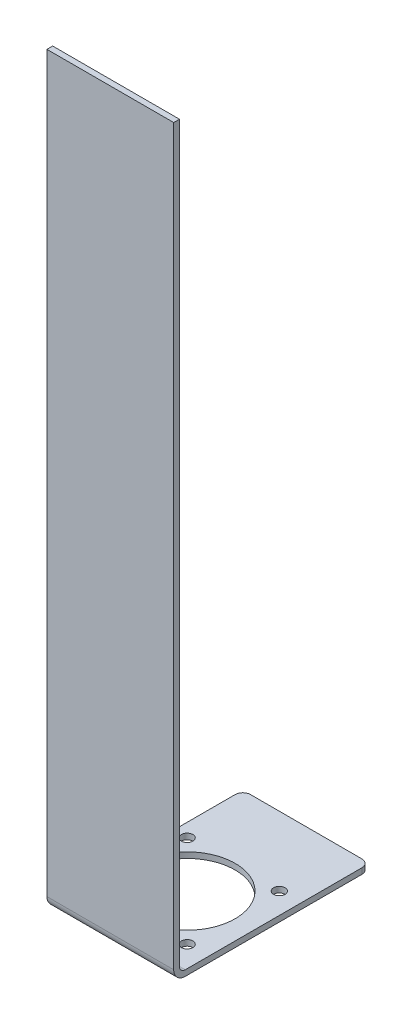
ISO-10303-21;
HEADER;
FILE_DESCRIPTION(('STEP AP214'),'2;1');
FILE_NAME('part.step','',(''),(''),'','','');
FILE_SCHEMA(('AUTOMOTIVE_DESIGN { 1 0 10303 214 1 1 1 1 }'));
ENDSEC;
DATA;
#1=APPLICATION_CONTEXT('core data for automotive mechanical design processes');
#2=APPLICATION_PROTOCOL_DEFINITION('international standard','automotive_design',2000,#1);
#3=PRODUCT_CONTEXT('',#1,'mechanical');
#4=PRODUCT('Part','Part','',(#3));
#5=PRODUCT_RELATED_PRODUCT_CATEGORY('part','',(#4));
#6=PRODUCT_DEFINITION_FORMATION('','',#4);
#7=PRODUCT_DEFINITION_CONTEXT('part definition',#1,'design');
#8=PRODUCT_DEFINITION('design','',#6,#7);
#9=PRODUCT_DEFINITION_SHAPE('','',#8);
#10=(LENGTH_UNIT() NAMED_UNIT(*) SI_UNIT(.MILLI.,.METRE.));
#11=(NAMED_UNIT(*) PLANE_ANGLE_UNIT() SI_UNIT($,.RADIAN.));
#12=(NAMED_UNIT(*) SI_UNIT($,.STERADIAN.) SOLID_ANGLE_UNIT());
#13=UNCERTAINTY_MEASURE_WITH_UNIT(LENGTH_MEASURE(1.E-05),#10,'distance_accuracy_value','');
#14=(GEOMETRIC_REPRESENTATION_CONTEXT(3) GLOBAL_UNCERTAINTY_ASSIGNED_CONTEXT((#13)) GLOBAL_UNIT_ASSIGNED_CONTEXT((#10,
#11,#12)) REPRESENTATION_CONTEXT('',''));
#15=CARTESIAN_POINT('',(0.,0.,0.));
#16=DIRECTION('',(0.,0.,1.));
#17=DIRECTION('',(1.,0.,0.));
#18=AXIS2_PLACEMENT_3D('',#15,#16,#17);
#19=CARTESIAN_POINT('',(0.,0.,51.));
#20=DIRECTION('',(0.,-1.,0.));
#21=DIRECTION('',(0.,0.,-1.));
#22=AXIS2_PLACEMENT_3D('',#19,#20,#21);
#23=PLANE('',#22);
#24=CARTESIAN_POINT('',(15.5,0.,30.));
#25=DIRECTION('',(0.,1.,0.));
#26=DIRECTION('',(0.,0.,1.));
#27=AXIS2_PLACEMENT_3D('',#24,#25,#26);
#28=CIRCLE('',#27,12.5);
#29=CARTESIAN_POINT('',(15.5,0.,42.5));
#30=VERTEX_POINT('',#29);
#31=EDGE_CURVE('E158',#30,#30,#28,.T.);
#32=ORIENTED_EDGE('',*,*,#31,.T.);
#33=EDGE_LOOP('',(#32));
#34=FACE_BOUND('',#33,.T.);
#35=CARTESIAN_POINT('',(27.5,0.,18.));
#36=DIRECTION('',(0.,-1.,0.));
#37=DIRECTION('',(0.,0.,-1.));
#38=AXIS2_PLACEMENT_3D('',#35,#36,#37);
#39=CIRCLE('',#38,1.5);
#40=CARTESIAN_POINT('',(27.5,0.,16.5));
#41=VERTEX_POINT('',#40);
#42=EDGE_CURVE('E161',#41,#41,#39,.F.);
#43=ORIENTED_EDGE('',*,*,#42,.T.);
#44=EDGE_LOOP('',(#43));
#45=FACE_BOUND('',#44,.T.);
#46=CARTESIAN_POINT('',(27.5,0.,42.));
#47=DIRECTION('',(0.,-1.,0.));
#48=DIRECTION('',(0.,0.,-1.));
#49=AXIS2_PLACEMENT_3D('',#46,#47,#48);
#50=CIRCLE('',#49,1.5);
#51=CARTESIAN_POINT('',(27.5,0.,40.5));
#52=VERTEX_POINT('',#51);
#53=EDGE_CURVE('E164',#52,#52,#50,.F.);
#54=ORIENTED_EDGE('',*,*,#53,.T.);
#55=EDGE_LOOP('',(#54));
#56=FACE_BOUND('',#55,.T.);
#57=CARTESIAN_POINT('',(3.5,0.,42.));
#58=DIRECTION('',(0.,-1.,0.));
#59=DIRECTION('',(0.,0.,-1.));
#60=AXIS2_PLACEMENT_3D('',#57,#58,#59);
#61=CIRCLE('',#60,1.5);
#62=CARTESIAN_POINT('',(3.5,0.,40.5));
#63=VERTEX_POINT('',#62);
#64=EDGE_CURVE('E116',#63,#63,#61,.F.);
#65=ORIENTED_EDGE('',*,*,#64,.T.);
#66=EDGE_LOOP('',(#65));
#67=FACE_BOUND('',#66,.T.);
#68=CARTESIAN_POINT('',(3.5,0.,18.));
#69=DIRECTION('',(0.,-1.,0.));
#70=DIRECTION('',(0.,0.,-1.));
#71=AXIS2_PLACEMENT_3D('',#68,#69,#70);
#72=CIRCLE('',#71,1.5);
#73=CARTESIAN_POINT('',(3.5,0.,16.5));
#74=VERTEX_POINT('',#73);
#75=EDGE_CURVE('E113',#74,#74,#72,.F.);
#76=ORIENTED_EDGE('',*,*,#75,.T.);
#77=EDGE_LOOP('',(#76));
#78=FACE_BOUND('',#77,.T.);
#79=DIRECTION('',(1.,0.,0.));
#80=VECTOR('',#79,1.);
#81=CARTESIAN_POINT('',(16.5,0.,48.));
#82=LINE('',#81,#80);
#83=CARTESIAN_POINT('',(0.,0.,48.));
#84=VERTEX_POINT('',#83);
#85=CARTESIAN_POINT('',(33.,0.,48.));
#86=VERTEX_POINT('',#85);
#87=EDGE_CURVE('E157',#84,#86,#82,.T.);
#88=ORIENTED_EDGE('',*,*,#87,.F.);
#89=DIRECTION('',(0.,0.,-1.));
#90=VECTOR('',#89,1.);
#91=CARTESIAN_POINT('',(0.,0.,44.9464285714286));
#92=LINE('',#91,#90);
#93=CARTESIAN_POINT('',(0.,0.,2.));
#94=VERTEX_POINT('',#93);
#95=EDGE_CURVE('E98',#84,#94,#92,.T.);
#96=ORIENTED_EDGE('',*,*,#95,.T.);
#97=CARTESIAN_POINT('',(2.,0.,2.));
#98=DIRECTION('',(0.,-1.,0.));
#99=DIRECTION('',(0.,0.,-1.));
#100=AXIS2_PLACEMENT_3D('',#97,#98,#99);
#101=CIRCLE('',#100,2.);
#102=CARTESIAN_POINT('',(2.,0.,0.));
#103=VERTEX_POINT('',#102);
#104=EDGE_CURVE('E20',#103,#94,#101,.F.);
#105=ORIENTED_EDGE('',*,*,#104,.F.);
#106=DIRECTION('',(-1.,0.,0.));
#107=VECTOR('',#106,1.);
#108=CARTESIAN_POINT('',(0.,0.,0.));
#109=LINE('',#108,#107);
#110=CARTESIAN_POINT('',(31.,0.,0.));
#111=VERTEX_POINT('',#110);
#112=EDGE_CURVE('E95',#111,#103,#109,.T.);
#113=ORIENTED_EDGE('',*,*,#112,.F.);
#114=CARTESIAN_POINT('',(31.,0.,2.));
#115=DIRECTION('',(0.,1.,0.));
#116=DIRECTION('',(0.,0.,1.));
#117=AXIS2_PLACEMENT_3D('',#114,#115,#116);
#118=CIRCLE('',#117,2.);
#119=CARTESIAN_POINT('',(33.,0.,2.));
#120=VERTEX_POINT('',#119);
#121=EDGE_CURVE('E110',#120,#111,#118,.T.);
#122=ORIENTED_EDGE('',*,*,#121,.F.);
#123=DIRECTION('',(0.,0.,-1.));
#124=VECTOR('',#123,1.);
#125=CARTESIAN_POINT('',(33.,0.,44.9464285714286));
#126=LINE('',#125,#124);
#127=EDGE_CURVE('E121',#86,#120,#126,.T.);
#128=ORIENTED_EDGE('',*,*,#127,.F.);
#129=EDGE_LOOP('',(#88,#96,#105,#113,#122,#128));
#130=FACE_BOUND('',#129,.T.);
#131=ADVANCED_FACE('F17',(#34,#45,#56,#67,#78,#130),#23,.T.);
#132=CARTESIAN_POINT('',(2.,38.7767857142857,2.00000000000001));
#133=DIRECTION('',(0.,-1.,0.));
#134=DIRECTION('',(0.,0.,-1.));
#135=AXIS2_PLACEMENT_3D('',#132,#133,#134);
#136=CYLINDRICAL_SURFACE('',#135,2.);
#137=CARTESIAN_POINT('',(2.,1.5,2.));
#138=DIRECTION('',(0.,-1.,0.));
#139=DIRECTION('',(0.,0.,-1.));
#140=AXIS2_PLACEMENT_3D('',#137,#138,#139);
#141=CIRCLE('',#140,2.);
#142=CARTESIAN_POINT('',(2.,1.5,0.));
#143=VERTEX_POINT('',#142);
#144=CARTESIAN_POINT('',(0.,1.5,2.));
#145=VERTEX_POINT('',#144);
#146=EDGE_CURVE('E105',#143,#145,#141,.F.);
#147=ORIENTED_EDGE('',*,*,#146,.F.);
#148=DIRECTION('',(0.,1.,0.));
#149=VECTOR('',#148,1.);
#150=CARTESIAN_POINT('',(2.,0.,0.));
#151=LINE('',#150,#149);
#152=EDGE_CURVE('E102',#103,#143,#151,.T.);
#153=ORIENTED_EDGE('',*,*,#152,.F.);
#154=ORIENTED_EDGE('',*,*,#104,.T.);
#155=DIRECTION('',(0.,1.,0.));
#156=VECTOR('',#155,1.);
#157=CARTESIAN_POINT('',(0.,77.5535714285714,2.));
#158=LINE('',#157,#156);
#159=EDGE_CURVE('E173',#94,#145,#158,.T.);
#160=ORIENTED_EDGE('',*,*,#159,.T.);
#161=EDGE_LOOP('',(#147,#153,#154,#160));
#162=FACE_BOUND('',#161,.T.);
#163=ADVANCED_FACE('F103',(#162),#136,.T.);
#164=CARTESIAN_POINT('',(31.,38.7767857142857,2.00000000000001));
#165=DIRECTION('',(0.,1.,0.));
#166=DIRECTION('',(0.,0.,1.));
#167=AXIS2_PLACEMENT_3D('',#164,#165,#166);
#168=CYLINDRICAL_SURFACE('',#167,2.);
#169=ORIENTED_EDGE('',*,*,#121,.T.);
#170=DIRECTION('',(0.,1.,0.));
#171=VECTOR('',#170,1.);
#172=CARTESIAN_POINT('',(31.,0.,0.));
#173=LINE('',#172,#171);
#174=CARTESIAN_POINT('',(31.,1.5,0.));
#175=VERTEX_POINT('',#174);
#176=EDGE_CURVE('E109',#175,#111,#173,.F.);
#177=ORIENTED_EDGE('',*,*,#176,.F.);
#178=CARTESIAN_POINT('',(31.,1.5,2.));
#179=DIRECTION('',(0.,1.,0.));
#180=DIRECTION('',(0.,0.,1.));
#181=AXIS2_PLACEMENT_3D('',#178,#179,#180);
#182=CIRCLE('',#181,2.);
#183=CARTESIAN_POINT('',(33.,1.5,2.));
#184=VERTEX_POINT('',#183);
#185=EDGE_CURVE('E145',#184,#175,#182,.T.);
#186=ORIENTED_EDGE('',*,*,#185,.F.);
#187=DIRECTION('',(0.,1.,0.));
#188=VECTOR('',#187,1.);
#189=CARTESIAN_POINT('',(33.,38.7767857142857,2.00000000000001));
#190=LINE('',#189,#188);
#191=EDGE_CURVE('E168',#184,#120,#190,.F.);
#192=ORIENTED_EDGE('',*,*,#191,.T.);
#193=EDGE_LOOP('',(#169,#177,#186,#192));
#194=FACE_BOUND('',#193,.T.);
#195=ADVANCED_FACE('F216',(#194),#168,.T.);
#196=CARTESIAN_POINT('',(0.,0.,0.));
#197=DIRECTION('',(0.,0.,-1.));
#198=DIRECTION('',(-1.,0.,0.));
#199=AXIS2_PLACEMENT_3D('',#196,#197,#198);
#200=PLANE('',#199);
#201=ORIENTED_EDGE('',*,*,#176,.T.);
#202=ORIENTED_EDGE('',*,*,#112,.T.);
#203=ORIENTED_EDGE('',*,*,#152,.T.);
#204=DIRECTION('',(1.,0.,0.));
#205=VECTOR('',#204,1.);
#206=CARTESIAN_POINT('',(0.,1.5,0.));
#207=LINE('',#206,#205);
#208=EDGE_CURVE('E144',#175,#143,#207,.F.);
#209=ORIENTED_EDGE('',*,*,#208,.F.);
#210=EDGE_LOOP('',(#201,#202,#203,#209));
#211=FACE_BOUND('',#210,.T.);
#212=ADVANCED_FACE('F112',(#211),#200,.T.);
#213=CARTESIAN_POINT('',(3.5,0.75,18.));
#214=DIRECTION('',(0.,-1.,0.));
#215=DIRECTION('',(0.,0.,-1.));
#216=AXIS2_PLACEMENT_3D('',#213,#214,#215);
#217=CYLINDRICAL_SURFACE('',#216,1.5);
#218=CARTESIAN_POINT('',(3.5,1.5,18.));
#219=DIRECTION('',(0.,-1.,0.));
#220=DIRECTION('',(0.,0.,-1.));
#221=AXIS2_PLACEMENT_3D('',#218,#219,#220);
#222=CIRCLE('',#221,1.5);
#223=CARTESIAN_POINT('',(3.5,1.5,16.5));
#224=VERTEX_POINT('',#223);
#225=EDGE_CURVE('E141',#224,#224,#222,.T.);
#226=ORIENTED_EDGE('',*,*,#225,.F.);
#227=EDGE_LOOP('',(#226));
#228=FACE_BOUND('',#227,.T.);
#229=ORIENTED_EDGE('',*,*,#75,.F.);
#230=EDGE_LOOP('',(#229));
#231=FACE_BOUND('',#230,.T.);
#232=ADVANCED_FACE('F224',(#228,#231),#217,.F.);
#233=CARTESIAN_POINT('',(3.5,0.75,42.));
#234=DIRECTION('',(0.,-1.,0.));
#235=DIRECTION('',(0.,0.,-1.));
#236=AXIS2_PLACEMENT_3D('',#233,#234,#235);
#237=CYLINDRICAL_SURFACE('',#236,1.5);
#238=CARTESIAN_POINT('',(3.5,1.5,42.));
#239=DIRECTION('',(0.,-1.,0.));
#240=DIRECTION('',(0.,0.,-1.));
#241=AXIS2_PLACEMENT_3D('',#238,#239,#240);
#242=CIRCLE('',#241,1.5);
#243=CARTESIAN_POINT('',(3.5,1.5,40.5));
#244=VERTEX_POINT('',#243);
#245=EDGE_CURVE('E138',#244,#244,#242,.T.);
#246=ORIENTED_EDGE('',*,*,#245,.F.);
#247=EDGE_LOOP('',(#246));
#248=FACE_BOUND('',#247,.T.);
#249=ORIENTED_EDGE('',*,*,#64,.F.);
#250=EDGE_LOOP('',(#249));
#251=FACE_BOUND('',#250,.T.);
#252=ADVANCED_FACE('F266',(#248,#251),#237,.F.);
#253=CARTESIAN_POINT('',(27.5,0.75,42.));
#254=DIRECTION('',(0.,-1.,0.));
#255=DIRECTION('',(0.,0.,-1.));
#256=AXIS2_PLACEMENT_3D('',#253,#254,#255);
#257=CYLINDRICAL_SURFACE('',#256,1.5);
#258=CARTESIAN_POINT('',(27.5,1.5,42.));
#259=DIRECTION('',(0.,-1.,0.));
#260=DIRECTION('',(0.,0.,-1.));
#261=AXIS2_PLACEMENT_3D('',#258,#259,#260);
#262=CIRCLE('',#261,1.5);
#263=CARTESIAN_POINT('',(27.5,1.5,40.5));
#264=VERTEX_POINT('',#263);
#265=EDGE_CURVE('E135',#264,#264,#262,.T.);
#266=ORIENTED_EDGE('',*,*,#265,.F.);
#267=EDGE_LOOP('',(#266));
#268=FACE_BOUND('',#267,.T.);
#269=ORIENTED_EDGE('',*,*,#53,.F.);
#270=EDGE_LOOP('',(#269));
#271=FACE_BOUND('',#270,.T.);
#272=ADVANCED_FACE('F262',(#268,#271),#257,.F.);
#273=CARTESIAN_POINT('',(27.5,0.75,18.));
#274=DIRECTION('',(0.,-1.,0.));
#275=DIRECTION('',(0.,0.,-1.));
#276=AXIS2_PLACEMENT_3D('',#273,#274,#275);
#277=CYLINDRICAL_SURFACE('',#276,1.5);
#278=CARTESIAN_POINT('',(27.5,1.5,18.));
#279=DIRECTION('',(0.,-1.,0.));
#280=DIRECTION('',(0.,0.,-1.));
#281=AXIS2_PLACEMENT_3D('',#278,#279,#280);
#282=CIRCLE('',#281,1.5);
#283=CARTESIAN_POINT('',(27.5,1.5,16.5));
#284=VERTEX_POINT('',#283);
#285=EDGE_CURVE('E132',#284,#284,#282,.T.);
#286=ORIENTED_EDGE('',*,*,#285,.F.);
#287=EDGE_LOOP('',(#286));
#288=FACE_BOUND('',#287,.T.);
#289=ORIENTED_EDGE('',*,*,#42,.F.);
#290=EDGE_LOOP('',(#289));
#291=FACE_BOUND('',#290,.T.);
#292=ADVANCED_FACE('F258',(#288,#291),#277,.F.);
#293=CARTESIAN_POINT('',(15.5,0.,30.));
#294=DIRECTION('',(0.,1.,0.));
#295=DIRECTION('',(0.,0.,1.));
#296=AXIS2_PLACEMENT_3D('',#293,#294,#295);
#297=CYLINDRICAL_SURFACE('',#296,12.5);
#298=ORIENTED_EDGE('',*,*,#31,.F.);
#299=EDGE_LOOP('',(#298));
#300=FACE_BOUND('',#299,.T.);
#301=CARTESIAN_POINT('',(15.5,1.5,30.));
#302=DIRECTION('',(0.,1.,0.));
#303=DIRECTION('',(0.,0.,1.));
#304=AXIS2_PLACEMENT_3D('',#301,#302,#303);
#305=CIRCLE('',#304,12.5);
#306=CARTESIAN_POINT('',(15.5,1.5,42.5));
#307=VERTEX_POINT('',#306);
#308=EDGE_CURVE('E129',#307,#307,#305,.F.);
#309=ORIENTED_EDGE('',*,*,#308,.F.);
#310=EDGE_LOOP('',(#309));
#311=FACE_BOUND('',#310,.T.);
#312=ADVANCED_FACE('F254',(#300,#311),#297,.F.);
#313=CARTESIAN_POINT('',(16.5,3.,48.));
#314=DIRECTION('',(1.,0.,0.));
#315=DIRECTION('',(0.,1.,0.));
#316=AXIS2_PLACEMENT_3D('',#313,#314,#315);
#317=CYLINDRICAL_SURFACE('',#316,3.);
#318=DIRECTION('',(1.,0.,0.));
#319=VECTOR('',#318,1.);
#320=CARTESIAN_POINT('',(0.,3.,51.));
#321=LINE('',#320,#319);
#322=CARTESIAN_POINT('',(0.,3.,51.));
#323=VERTEX_POINT('',#322);
#324=CARTESIAN_POINT('',(33.,3.,51.));
#325=VERTEX_POINT('',#324);
#326=EDGE_CURVE('E128',#323,#325,#321,.T.);
#327=ORIENTED_EDGE('',*,*,#326,.F.);
#328=CARTESIAN_POINT('',(0.,3.,48.));
#329=DIRECTION('',(1.,0.,0.));
#330=DIRECTION('',(0.,1.,0.));
#331=AXIS2_PLACEMENT_3D('',#328,#329,#330);
#332=CIRCLE('',#331,3.);
#333=EDGE_CURVE('E151',#84,#323,#332,.F.);
#334=ORIENTED_EDGE('',*,*,#333,.F.);
#335=ORIENTED_EDGE('',*,*,#87,.T.);
#336=CARTESIAN_POINT('',(33.,3.,48.));
#337=DIRECTION('',(1.,0.,0.));
#338=DIRECTION('',(0.,1.,0.));
#339=AXIS2_PLACEMENT_3D('',#336,#337,#338);
#340=CIRCLE('',#339,3.);
#341=EDGE_CURVE('E154',#325,#86,#340,.T.);
#342=ORIENTED_EDGE('',*,*,#341,.F.);
#343=EDGE_LOOP('',(#327,#334,#335,#342));
#344=FACE_BOUND('',#343,.T.);
#345=ADVANCED_FACE('F250',(#344),#317,.T.);
#346=CARTESIAN_POINT('',(0.,1.5,0.));
#347=DIRECTION('',(0.,1.,0.));
#348=DIRECTION('',(0.,0.,1.));
#349=AXIS2_PLACEMENT_3D('',#346,#347,#348);
#350=PLANE('',#349);
#351=ORIENTED_EDGE('',*,*,#308,.T.);
#352=EDGE_LOOP('',(#351));
#353=FACE_BOUND('',#352,.T.);
#354=ORIENTED_EDGE('',*,*,#285,.T.);
#355=EDGE_LOOP('',(#354));
#356=FACE_BOUND('',#355,.T.);
#357=ORIENTED_EDGE('',*,*,#265,.T.);
#358=EDGE_LOOP('',(#357));
#359=FACE_BOUND('',#358,.T.);
#360=ORIENTED_EDGE('',*,*,#245,.T.);
#361=EDGE_LOOP('',(#360));
#362=FACE_BOUND('',#361,.T.);
#363=ORIENTED_EDGE('',*,*,#225,.T.);
#364=EDGE_LOOP('',(#363));
#365=FACE_BOUND('',#364,.T.);
#366=ORIENTED_EDGE('',*,*,#185,.T.);
#367=ORIENTED_EDGE('',*,*,#208,.T.);
#368=ORIENTED_EDGE('',*,*,#146,.T.);
#369=DIRECTION('',(0.,0.,1.));
#370=VECTOR('',#369,1.);
#371=CARTESIAN_POINT('',(0.,1.5,0.));
#372=LINE('',#371,#370);
#373=CARTESIAN_POINT('',(0.,1.5,48.));
#374=VERTEX_POINT('',#373);
#375=EDGE_CURVE('E150',#145,#374,#372,.T.);
#376=ORIENTED_EDGE('',*,*,#375,.T.);
#377=DIRECTION('',(1.,0.,0.));
#378=VECTOR('',#377,1.);
#379=CARTESIAN_POINT('',(16.5,1.50000000000001,48.));
#380=LINE('',#379,#378);
#381=CARTESIAN_POINT('',(33.,1.5,48.));
#382=VERTEX_POINT('',#381);
#383=EDGE_CURVE('E125',#374,#382,#380,.T.);
#384=ORIENTED_EDGE('',*,*,#383,.T.);
#385=DIRECTION('',(0.,0.,1.));
#386=VECTOR('',#385,1.);
#387=CARTESIAN_POINT('',(33.,1.5,0.));
#388=LINE('',#387,#386);
#389=EDGE_CURVE('E148',#382,#184,#388,.F.);
#390=ORIENTED_EDGE('',*,*,#389,.T.);
#391=EDGE_LOOP('',(#366,#367,#368,#376,#384,#390));
#392=FACE_BOUND('',#391,.T.);
#393=ADVANCED_FACE('F209',(#353,#356,#359,#362,#365,#392),#350,.T.);
#394=CARTESIAN_POINT('',(0.,194.,51.));
#395=DIRECTION('',(0.,0.,1.));
#396=DIRECTION('',(1.,0.,0.));
#397=AXIS2_PLACEMENT_3D('',#394,#395,#396);
#398=PLANE('',#397);
#399=DIRECTION('',(1.,0.,0.));
#400=VECTOR('',#399,1.);
#401=CARTESIAN_POINT('',(0.,194.,51.));
#402=LINE('',#401,#400);
#403=CARTESIAN_POINT('',(0.,194.,51.));
#404=VERTEX_POINT('',#403);
#405=CARTESIAN_POINT('',(33.,194.,51.));
#406=VERTEX_POINT('',#405);
#407=EDGE_CURVE('E191',#404,#406,#402,.T.);
#408=ORIENTED_EDGE('',*,*,#407,.F.);
#409=DIRECTION('',(0.,1.,0.));
#410=VECTOR('',#409,1.);
#411=CARTESIAN_POINT('',(0.,77.5535714285714,51.));
#412=LINE('',#411,#410);
#413=EDGE_CURVE('E178',#404,#323,#412,.F.);
#414=ORIENTED_EDGE('',*,*,#413,.T.);
#415=ORIENTED_EDGE('',*,*,#326,.T.);
#416=DIRECTION('',(0.,1.,0.));
#417=VECTOR('',#416,1.);
#418=CARTESIAN_POINT('',(33.,77.5535714285714,51.));
#419=LINE('',#418,#417);
#420=EDGE_CURVE('E183',#406,#325,#419,.F.);
#421=ORIENTED_EDGE('',*,*,#420,.F.);
#422=EDGE_LOOP('',(#408,#414,#415,#421));
#423=FACE_BOUND('',#422,.T.);
#424=ADVANCED_FACE('F244',(#423),#398,.T.);
#425=CARTESIAN_POINT('',(16.5,3.,48.));
#426=DIRECTION('',(1.,0.,0.));
#427=DIRECTION('',(0.,1.,0.));
#428=AXIS2_PLACEMENT_3D('',#425,#426,#427);
#429=CYLINDRICAL_SURFACE('',#428,1.49999999999999);
#430=CARTESIAN_POINT('',(0.,3.,48.));
#431=DIRECTION('',(1.,0.,0.));
#432=DIRECTION('',(0.,1.,0.));
#433=AXIS2_PLACEMENT_3D('',#430,#431,#432);
#434=CIRCLE('',#433,1.49999999999999);
#435=CARTESIAN_POINT('',(0.,3.,49.5));
#436=VERTEX_POINT('',#435);
#437=EDGE_CURVE('E123',#436,#374,#434,.T.);
#438=ORIENTED_EDGE('',*,*,#437,.F.);
#439=DIRECTION('',(-1.,0.,0.));
#440=VECTOR('',#439,1.);
#441=CARTESIAN_POINT('',(0.,3.,49.5));
#442=LINE('',#441,#440);
#443=CARTESIAN_POINT('',(33.,3.,49.5));
#444=VERTEX_POINT('',#443);
#445=EDGE_CURVE('E185',#444,#436,#442,.T.);
#446=ORIENTED_EDGE('',*,*,#445,.F.);
#447=CARTESIAN_POINT('',(33.,3.,48.));
#448=DIRECTION('',(1.,0.,0.));
#449=DIRECTION('',(0.,1.,0.));
#450=AXIS2_PLACEMENT_3D('',#447,#448,#449);
#451=CIRCLE('',#450,1.49999999999999);
#452=EDGE_CURVE('E126',#382,#444,#451,.F.);
#453=ORIENTED_EDGE('',*,*,#452,.F.);
#454=ORIENTED_EDGE('',*,*,#383,.F.);
#455=EDGE_LOOP('',(#438,#446,#453,#454));
#456=FACE_BOUND('',#455,.T.);
#457=ADVANCED_FACE('F213',(#456),#429,.F.);
#458=CARTESIAN_POINT('',(0.,77.5535714285714,44.9464285714286));
#459=DIRECTION('',(1.,0.,0.));
#460=DIRECTION('',(0.,0.,-1.));
#461=AXIS2_PLACEMENT_3D('',#458,#459,#460);
#462=PLANE('',#461);
#463=ORIENTED_EDGE('',*,*,#413,.F.);
#464=DIRECTION('',(0.,0.,1.));
#465=VECTOR('',#464,1.);
#466=CARTESIAN_POINT('',(0.,194.,49.5));
#467=LINE('',#466,#465);
#468=CARTESIAN_POINT('',(0.,194.,49.5));
#469=VERTEX_POINT('',#468);
#470=EDGE_CURVE('E180',#469,#404,#467,.T.);
#471=ORIENTED_EDGE('',*,*,#470,.F.);
#472=DIRECTION('',(0.,1.,0.));
#473=VECTOR('',#472,1.);
#474=CARTESIAN_POINT('',(0.,1.49999999999999,49.5));
#475=LINE('',#474,#473);
#476=EDGE_CURVE('E189',#436,#469,#475,.T.);
#477=ORIENTED_EDGE('',*,*,#476,.F.);
#478=ORIENTED_EDGE('',*,*,#437,.T.);
#479=ORIENTED_EDGE('',*,*,#375,.F.);
#480=ORIENTED_EDGE('',*,*,#159,.F.);
#481=ORIENTED_EDGE('',*,*,#95,.F.);
#482=ORIENTED_EDGE('',*,*,#333,.T.);
#483=EDGE_LOOP('',(#463,#471,#477,#478,#479,#480,#481,#482));
#484=FACE_BOUND('',#483,.T.);
#485=ADVANCED_FACE('F238',(#484),#462,.F.);
#486=CARTESIAN_POINT('',(0.,194.,49.5));
#487=DIRECTION('',(0.,1.,0.));
#488=DIRECTION('',(0.,0.,1.));
#489=AXIS2_PLACEMENT_3D('',#486,#487,#488);
#490=PLANE('',#489);
#491=DIRECTION('',(0.,0.,-1.));
#492=VECTOR('',#491,1.);
#493=CARTESIAN_POINT('',(33.,194.,44.9464285714286));
#494=LINE('',#493,#492);
#495=CARTESIAN_POINT('',(33.,194.,49.5));
#496=VERTEX_POINT('',#495);
#497=EDGE_CURVE('E35',#496,#406,#494,.F.);
#498=ORIENTED_EDGE('',*,*,#497,.F.);
#499=DIRECTION('',(-1.,0.,0.));
#500=VECTOR('',#499,1.);
#501=CARTESIAN_POINT('',(0.,194.,49.5));
#502=LINE('',#501,#500);
#503=EDGE_CURVE('E26',#469,#496,#502,.F.);
#504=ORIENTED_EDGE('',*,*,#503,.F.);
#505=ORIENTED_EDGE('',*,*,#470,.T.);
#506=ORIENTED_EDGE('',*,*,#407,.T.);
#507=EDGE_LOOP('',(#498,#504,#505,#506));
#508=FACE_BOUND('',#507,.T.);
#509=ADVANCED_FACE('F233',(#508),#490,.T.);
#510=CARTESIAN_POINT('',(33.,77.5535714285714,44.9464285714286));
#511=DIRECTION('',(1.,0.,0.));
#512=DIRECTION('',(0.,0.,-1.));
#513=AXIS2_PLACEMENT_3D('',#510,#511,#512);
#514=PLANE('',#513);
#515=ORIENTED_EDGE('',*,*,#497,.T.);
#516=ORIENTED_EDGE('',*,*,#420,.T.);
#517=ORIENTED_EDGE('',*,*,#341,.T.);
#518=ORIENTED_EDGE('',*,*,#127,.T.);
#519=ORIENTED_EDGE('',*,*,#191,.F.);
#520=ORIENTED_EDGE('',*,*,#389,.F.);
#521=ORIENTED_EDGE('',*,*,#452,.T.);
#522=DIRECTION('',(0.,1.,0.));
#523=VECTOR('',#522,1.);
#524=CARTESIAN_POINT('',(33.,1.49999999999999,49.5));
#525=LINE('',#524,#523);
#526=EDGE_CURVE('E11',#496,#444,#525,.F.);
#527=ORIENTED_EDGE('',*,*,#526,.F.);
#528=EDGE_LOOP('',(#515,#516,#517,#518,#519,#520,#521,#527));
#529=FACE_BOUND('',#528,.T.);
#530=ADVANCED_FACE('F214',(#529),#514,.T.);
#531=CARTESIAN_POINT('',(0.,1.49999999999999,49.5));
#532=DIRECTION('',(0.,0.,-1.));
#533=DIRECTION('',(-1.,0.,0.));
#534=AXIS2_PLACEMENT_3D('',#531,#532,#533);
#535=PLANE('',#534);
#536=ORIENTED_EDGE('',*,*,#503,.T.);
#537=ORIENTED_EDGE('',*,*,#526,.T.);
#538=ORIENTED_EDGE('',*,*,#445,.T.);
#539=ORIENTED_EDGE('',*,*,#476,.T.);
#540=EDGE_LOOP('',(#536,#537,#538,#539));
#541=FACE_BOUND('',#540,.T.);
#542=ADVANCED_FACE('F226',(#541),#535,.T.);
#543=CLOSED_SHELL('',(#131,#163,#195,#212,#232,#252,#272,#292,#312,#345,#393,#424,#457,#485,
#509,#530,#542));
#544=MANIFOLD_SOLID_BREP('B1',#543);
#545=ADVANCED_BREP_SHAPE_REPRESENTATION('',(#18,#544),#14);
#546=SHAPE_DEFINITION_REPRESENTATION(#9,#545);
ENDSEC;
END-ISO-10303-21;
